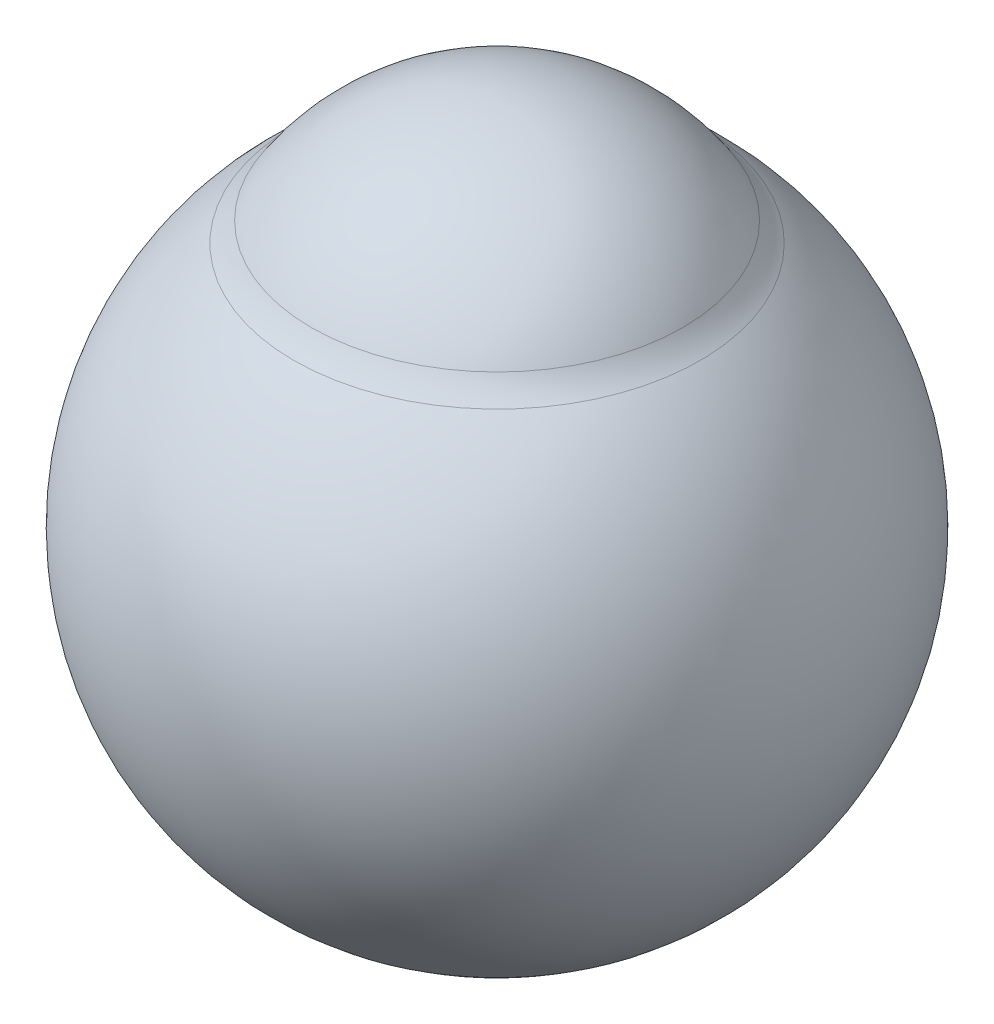
ISO-10303-21;
HEADER;
FILE_DESCRIPTION(('STEP AP214'),'2;1');
FILE_NAME('part.step','',(''),(''),'','','');
FILE_SCHEMA(('AUTOMOTIVE_DESIGN { 1 0 10303 214 1 1 1 1 }'));
ENDSEC;
DATA;
#1=APPLICATION_CONTEXT('core data for automotive mechanical design processes');
#2=APPLICATION_PROTOCOL_DEFINITION('international standard','automotive_design',2000,#1);
#3=PRODUCT_CONTEXT('',#1,'mechanical');
#4=PRODUCT('Part','Part','',(#3));
#5=PRODUCT_RELATED_PRODUCT_CATEGORY('part','',(#4));
#6=PRODUCT_DEFINITION_FORMATION('','',#4);
#7=PRODUCT_DEFINITION_CONTEXT('part definition',#1,'design');
#8=PRODUCT_DEFINITION('design','',#6,#7);
#9=PRODUCT_DEFINITION_SHAPE('','',#8);
#10=(LENGTH_UNIT() NAMED_UNIT(*) SI_UNIT(.MILLI.,.METRE.));
#11=(NAMED_UNIT(*) PLANE_ANGLE_UNIT() SI_UNIT($,.RADIAN.));
#12=(NAMED_UNIT(*) SI_UNIT($,.STERADIAN.) SOLID_ANGLE_UNIT());
#13=UNCERTAINTY_MEASURE_WITH_UNIT(LENGTH_MEASURE(1.E-05),#10,'distance_accuracy_value','');
#14=(GEOMETRIC_REPRESENTATION_CONTEXT(3) GLOBAL_UNCERTAINTY_ASSIGNED_CONTEXT((#13)) GLOBAL_UNIT_ASSIGNED_CONTEXT((#10,
#11,#12)) REPRESENTATION_CONTEXT('',''));
#15=CARTESIAN_POINT('',(0.,0.,0.));
#16=DIRECTION('',(0.,0.,1.));
#17=DIRECTION('',(1.,0.,0.));
#18=AXIS2_PLACEMENT_3D('',#15,#16,#17);
#19=CARTESIAN_POINT('',(0.,-5.22,0.));
#20=DIRECTION('',(0.,1.,0.));
#21=DIRECTION('',(-1.,0.,0.));
#22=AXIS2_PLACEMENT_3D('',#19,#20,#21);
#23=SPHERICAL_SURFACE('',#22,11.3);
#24=CARTESIAN_POINT('',(0.,3.49186614152133,0.));
#25=DIRECTION('',(0.,1.,0.));
#26=DIRECTION('',(0.,0.,1.));
#27=AXIS2_PLACEMENT_3D('',#24,#25,#26);
#28=CIRCLE('',#27,7.19676235068343);
#29=CARTESIAN_POINT('',(0.,3.49186614152133,7.19676235068343));
#30=VERTEX_POINT('',#29);
#31=EDGE_CURVE('E69',#30,#30,#28,.T.);
#32=ORIENTED_EDGE('',*,*,#31,.F.);
#33=EDGE_LOOP('',(#32));
#34=FACE_BOUND('',#33,.T.);
#35=ADVANCED_FACE('F42',(#34),#23,.T.);
#36=CARTESIAN_POINT('',(0.,5.80475095785442,0.));
#37=DIRECTION('',(0.,1.,0.));
#38=DIRECTION('',(0.,0.,1.));
#39=AXIS2_PLACEMENT_3D('',#36,#37,#38);
#40=TOROIDAL_SURFACE('',#39,9.10740722254628,3.);
#41=CARTESIAN_POINT('',(0.,4.19232013622819,0.));
#42=DIRECTION('',(0.,1.,0.));
#43=DIRECTION('',(0.,0.,1.));
#44=AXIS2_PLACEMENT_3D('',#41,#42,#43);
#45=CIRCLE('',#44,6.57757188295009);
#46=CARTESIAN_POINT('',(0.,4.19232013622819,6.57757188295009));
#47=VERTEX_POINT('',#46);
#48=EDGE_CURVE('E113',#47,#47,#45,.T.);
#49=ORIENTED_EDGE('',*,*,#48,.F.);
#50=EDGE_LOOP('',(#49));
#51=FACE_BOUND('',#50,.T.);
#52=ORIENTED_EDGE('',*,*,#31,.T.);
#53=EDGE_LOOP('',(#52));
#54=FACE_BOUND('',#53,.T.);
#55=ADVANCED_FACE('F121',(#51,#54),#40,.F.);
#56=CARTESIAN_POINT('',(0.,0.,0.));
#57=DIRECTION('',(0.,1.,0.));
#58=DIRECTION('',(1.,0.,0.));
#59=AXIS2_PLACEMENT_3D('',#56,#57,#58);
#60=SPHERICAL_SURFACE('',#59,7.8);
#61=ORIENTED_EDGE('',*,*,#48,.T.);
#62=EDGE_LOOP('',(#61));
#63=FACE_BOUND('',#62,.T.);
#64=ADVANCED_FACE('F127',(#63),#60,.T.);
#65=CLOSED_SHELL('',(#35,#55,#64));
#66=CARTESIAN_POINT('',(0.,4.28,0.));
#67=DIRECTION('',(0.,1.,0.));
#68=DIRECTION('',(0.,0.,1.));
#69=AXIS2_PLACEMENT_3D('',#66,#67,#68);
#70=TOROIDAL_SURFACE('',#69,5.46534536877589,0.1);
#71=CARTESIAN_POINT('',(0.,4.33606060606061,0.));
#72=DIRECTION('',(0.,1.,0.));
#73=DIRECTION('',(0.,0.,1.));
#74=AXIS2_PLACEMENT_3D('',#71,#72,#73);
#75=CIRCLE('',#74,5.54815363193916);
#76=CARTESIAN_POINT('',(0.,4.33606060606061,5.54815363193916));
#77=VERTEX_POINT('',#76);
#78=EDGE_CURVE('E111',#77,#77,#75,.T.);
#79=ORIENTED_EDGE('',*,*,#78,.T.);
#80=EDGE_LOOP('',(#79));
#81=FACE_BOUND('',#80,.T.);
#82=CARTESIAN_POINT('',(0.,4.18,0.));
#83=DIRECTION('',(0.,1.,0.));
#84=DIRECTION('',(0.,0.,1.));
#85=AXIS2_PLACEMENT_3D('',#82,#83,#84);
#86=CIRCLE('',#85,5.46534536877589);
#87=CARTESIAN_POINT('',(0.,4.18,5.46534536877589));
#88=VERTEX_POINT('',#87);
#89=EDGE_CURVE('E11',#88,#88,#86,.T.);
#90=ORIENTED_EDGE('',*,*,#89,.F.);
#91=EDGE_LOOP('',(#90));
#92=FACE_BOUND('',#91,.T.);
#93=ADVANCED_FACE('F44',(#81,#92),#70,.F.);
#94=CARTESIAN_POINT('',(5.65000000000003,4.18,0.));
#95=DIRECTION('',(0.,1.,0.));
#96=DIRECTION('',(0.,0.,1.));
#97=AXIS2_PLACEMENT_3D('',#94,#95,#96);
#98=PLANE('',#97);
#99=ORIENTED_EDGE('',*,*,#89,.T.);
#100=EDGE_LOOP('',(#99));
#101=FACE_BOUND('',#100,.T.);
#102=CARTESIAN_POINT('',(0.,4.18,0.));
#103=DIRECTION('',(0.,1.,0.));
#104=DIRECTION('',(0.,0.,1.));
#105=AXIS2_PLACEMENT_3D('',#102,#103,#104);
#106=CIRCLE('',#105,1.50000000000001);
#107=CARTESIAN_POINT('',(0.,4.18,1.50000000000001));
#108=VERTEX_POINT('',#107);
#109=EDGE_CURVE('E50',#108,#108,#106,.T.);
#110=ORIENTED_EDGE('',*,*,#109,.F.);
#111=EDGE_LOOP('',(#110));
#112=FACE_BOUND('',#111,.T.);
#113=ADVANCED_FACE('F97',(#101,#112),#98,.T.);
#114=CARTESIAN_POINT('',(0.,60.244207804498,0.));
#115=DIRECTION('',(0.,1.,0.));
#116=DIRECTION('',(0.,0.,1.));
#117=AXIS2_PLACEMENT_3D('',#114,#115,#116);
#118=CYLINDRICAL_SURFACE('',#117,1.5);
#119=CARTESIAN_POINT('',(0.,4.08,0.));
#120=DIRECTION('',(0.,1.,0.));
#121=DIRECTION('',(0.,0.,1.));
#122=AXIS2_PLACEMENT_3D('',#119,#120,#121);
#123=CIRCLE('',#122,1.5);
#124=CARTESIAN_POINT('',(0.,4.08,1.5));
#125=VERTEX_POINT('',#124);
#126=EDGE_CURVE('E54',#125,#125,#123,.T.);
#127=ORIENTED_EDGE('',*,*,#126,.F.);
#128=EDGE_LOOP('',(#127));
#129=FACE_BOUND('',#128,.T.);
#130=ORIENTED_EDGE('',*,*,#109,.T.);
#131=EDGE_LOOP('',(#130));
#132=FACE_BOUND('',#131,.T.);
#133=ADVANCED_FACE('F94',(#129,#132),#118,.F.);
#134=CARTESIAN_POINT('',(5.65000000000001,4.08,0.));
#135=DIRECTION('',(0.,1.,0.));
#136=DIRECTION('',(0.,0.,1.));
#137=AXIS2_PLACEMENT_3D('',#134,#135,#136);
#138=PLANE('',#137);
#139=CARTESIAN_POINT('',(0.,4.08,0.));
#140=DIRECTION('',(0.,1.,0.));
#141=DIRECTION('',(0.,0.,1.));
#142=AXIS2_PLACEMENT_3D('',#139,#140,#141);
#143=CIRCLE('',#142,5.49286111270783);
#144=CARTESIAN_POINT('',(0.,4.08,5.49286111270783));
#145=VERTEX_POINT('',#144);
#146=EDGE_CURVE('E66',#145,#145,#143,.T.);
#147=ORIENTED_EDGE('',*,*,#146,.F.);
#148=EDGE_LOOP('',(#147));
#149=FACE_BOUND('',#148,.T.);
#150=ORIENTED_EDGE('',*,*,#126,.T.);
#151=EDGE_LOOP('',(#150));
#152=FACE_BOUND('',#151,.T.);
#153=ADVANCED_FACE('F90',(#149,#152),#138,.F.);
#154=CARTESIAN_POINT('',(0.,3.88,0.));
#155=DIRECTION('',(0.,1.,0.));
#156=DIRECTION('',(0.,0.,1.));
#157=AXIS2_PLACEMENT_3D('',#154,#155,#156);
#158=TOROIDAL_SURFACE('',#157,5.49286111270783,0.2);
#159=ORIENTED_EDGE('',*,*,#146,.T.);
#160=EDGE_LOOP('',(#159));
#161=FACE_BOUND('',#160,.T.);
#162=CARTESIAN_POINT('',(0.,3.77729884426788,0.));
#163=DIRECTION('',(0.,1.,0.));
#164=DIRECTION('',(0.,0.,1.));
#165=AXIS2_PLACEMENT_3D('',#162,#163,#164);
#166=CIRCLE('',#165,5.66447833973148);
#167=CARTESIAN_POINT('',(0.,3.77729884426788,5.66447833973148));
#168=VERTEX_POINT('',#167);
#169=EDGE_CURVE('E58',#168,#168,#166,.T.);
#170=ORIENTED_EDGE('',*,*,#169,.F.);
#171=EDGE_LOOP('',(#170));
#172=FACE_BOUND('',#171,.T.);
#173=ADVANCED_FACE('F84',(#161,#172),#158,.F.);
#174=CARTESIAN_POINT('',(5.66447833973148,3.77729884426788,0.));
#175=CARTESIAN_POINT('',(5.5279751095847,3.54919716740944,0.));
#176=CARTESIAN_POINT('',(5.41722874248823,2.85435998139794,0.));
#177=CARTESIAN_POINT('',(6.98381678169419,2.52194058263642,0.));
#178=CARTESIAN_POINT('',(8.08067984008828,1.91737045606787,0.));
#179=CARTESIAN_POINT('',(8.532298411183,1.72995246332986,0.));
#180=B_SPLINE_CURVE_WITH_KNOTS('',3,(#174,#175,#176,#177,#178,#179),.UNSPECIFIED.,.F.,.F.,(4,1,
1,4),(0.0655508431652009,0.226972150887283,0.688222094473368,1.),.UNSPECIFIED.);
#181=CARTESIAN_POINT('',(0.,60.244207804498,0.));
#182=DIRECTION('',(0.,1.,0.));
#183=AXIS1_PLACEMENT('',#181,#182);
#184=SURFACE_OF_REVOLUTION('',#180,#183);
#185=CARTESIAN_POINT('',(0.,1.72995246332985,0.));
#186=DIRECTION('',(0.,1.,0.));
#187=DIRECTION('',(0.,0.,1.));
#188=AXIS2_PLACEMENT_3D('',#185,#186,#187);
#189=CIRCLE('',#188,8.53229841118299);
#190=CARTESIAN_POINT('',(0.,1.72995246332985,8.53229841118299));
#191=VERTEX_POINT('',#190);
#192=EDGE_CURVE('E63',#191,#191,#189,.T.);
#193=ORIENTED_EDGE('',*,*,#192,.F.);
#194=EDGE_LOOP('',(#193));
#195=FACE_BOUND('',#194,.T.);
#196=ORIENTED_EDGE('',*,*,#169,.T.);
#197=EDGE_LOOP('',(#196));
#198=FACE_BOUND('',#197,.T.);
#199=ADVANCED_FACE('F79',(#195,#198),#184,.T.);
#200=CARTESIAN_POINT('',(0.,-5.20489802409883,0.));
#201=DIRECTION('',(0.,1.,0.));
#202=DIRECTION('',(1.,0.,0.));
#203=AXIS2_PLACEMENT_3D('',#200,#201,#202);
#204=SPHERICAL_SURFACE('',#203,10.9951019759012);
#205=ORIENTED_EDGE('',*,*,#192,.T.);
#206=EDGE_LOOP('',(#205));
#207=FACE_BOUND('',#206,.T.);
#208=ADVANCED_FACE('F83',(#207),#204,.F.);
#209=CARTESIAN_POINT('',(0.,0.58,0.));
#210=DIRECTION('',(0.,1.,0.));
#211=DIRECTION('',(1.,0.,0.));
#212=AXIS2_PLACEMENT_3D('',#209,#210,#211);
#213=SPHERICAL_SURFACE('',#212,6.7);
#214=ORIENTED_EDGE('',*,*,#78,.F.);
#215=EDGE_LOOP('',(#214));
#216=FACE_BOUND('',#215,.T.);
#217=ADVANCED_FACE('F132',(#216),#213,.F.);
#218=CLOSED_SHELL('',(#93,#113,#133,#153,#173,#199,#208,#217));
#219=ORIENTED_CLOSED_SHELL('',*,#218,.T.);
#220=BREP_WITH_VOIDS('B2',#65,(#219));
#221=CARTESIAN_POINT('',(0.,6.38,0.));
#222=DIRECTION('',(0.,1.,0.));
#223=DIRECTION('',(1.,0.,0.));
#224=AXIS2_PLACEMENT_3D('',#221,#222,#223);
#225=SPHERICAL_SURFACE('',#224,6.);
#226=CARTESIAN_POINT('',(0.,2.70993314369954,0.));
#227=DIRECTION('',(0.,1.,0.));
#228=DIRECTION('',(0.,0.,1.));
#229=AXIS2_PLACEMENT_3D('',#226,#227,#228);
#230=CIRCLE('',#229,4.74664189404308);
#231=CARTESIAN_POINT('',(0.,2.70993314369954,4.74664189404308));
#232=VERTEX_POINT('',#231);
#233=EDGE_CURVE('E40',#232,#232,#230,.T.);
#234=ORIENTED_EDGE('',*,*,#233,.F.);
#235=EDGE_LOOP('',(#234));
#236=FACE_BOUND('',#235,.T.);
#237=ADVANCED_FACE('F215',(#236),#225,.T.);
#238=CARTESIAN_POINT('',(0.,2.78938488284875,0.));
#239=DIRECTION('',(0.,1.,0.));
#240=DIRECTION('',(0.,0.,1.));
#241=AXIS2_PLACEMENT_3D('',#238,#239,#240);
#242=TOROIDAL_SURFACE('',#241,4.64388383312306,0.129891485240088);
#243=CARTESIAN_POINT('',(0.,2.90400114428793,0.));
#244=DIRECTION('',(0.,1.,0.));
#245=DIRECTION('',(0.,0.,1.));
#246=AXIS2_PLACEMENT_3D('',#243,#244,#245);
#247=CIRCLE('',#246,4.70499774767271);
#248=CARTESIAN_POINT('',(0.,2.90400114428793,4.70499774767271));
#249=VERTEX_POINT('',#248);
#250=EDGE_CURVE('E221',#249,#249,#247,.T.);
#251=ORIENTED_EDGE('',*,*,#250,.F.);
#252=EDGE_LOOP('',(#251));
#253=FACE_BOUND('',#252,.T.);
#254=ORIENTED_EDGE('',*,*,#233,.T.);
#255=EDGE_LOOP('',(#254));
#256=FACE_BOUND('',#255,.T.);
#257=ADVANCED_FACE('F229',(#253,#256),#242,.T.);
#258=CARTESIAN_POINT('',(0.,-5.92,0.));
#259=DIRECTION('',(0.,1.,0.));
#260=DIRECTION('',(1.,0.,0.));
#261=AXIS2_PLACEMENT_3D('',#258,#259,#260);
#262=SPHERICAL_SURFACE('',#261,9.99999999999999);
#263=ORIENTED_EDGE('',*,*,#250,.T.);
#264=EDGE_LOOP('',(#263));
#265=FACE_BOUND('',#264,.T.);
#266=ADVANCED_FACE('F227',(#265),#262,.T.);
#267=CLOSED_SHELL('',(#237,#257,#266));
#268=MANIFOLD_SOLID_BREP('B6',#267);
#269=ADVANCED_BREP_SHAPE_REPRESENTATION('',(#18,#220,#268),#14);
#270=SHAPE_DEFINITION_REPRESENTATION(#9,#269);
ENDSEC;
END-ISO-10303-21;
